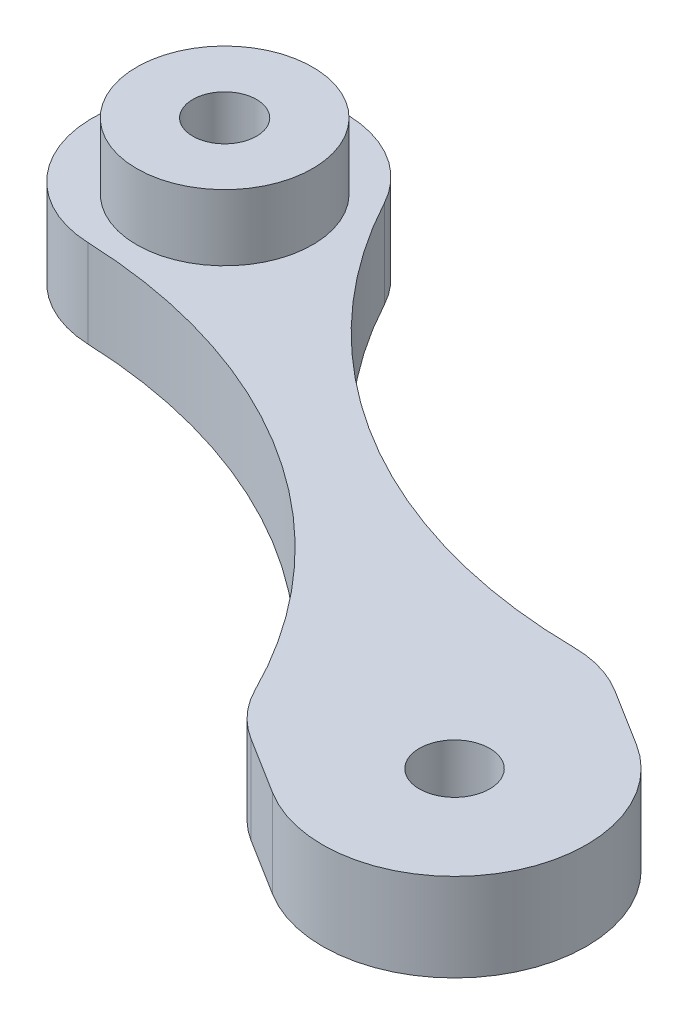
ISO-10303-21;
HEADER;
FILE_DESCRIPTION(('STEP AP214'),'2;1');
FILE_NAME('part.step','',(''),(''),'','','');
FILE_SCHEMA(('AUTOMOTIVE_DESIGN { 1 0 10303 214 1 1 1 1 }'));
ENDSEC;
DATA;
#1=APPLICATION_CONTEXT('core data for automotive mechanical design processes');
#2=APPLICATION_PROTOCOL_DEFINITION('international standard','automotive_design',2000,#1);
#3=PRODUCT_CONTEXT('',#1,'mechanical');
#4=PRODUCT('Part','Part','',(#3));
#5=PRODUCT_RELATED_PRODUCT_CATEGORY('part','',(#4));
#6=PRODUCT_DEFINITION_FORMATION('','',#4);
#7=PRODUCT_DEFINITION_CONTEXT('part definition',#1,'design');
#8=PRODUCT_DEFINITION('design','',#6,#7);
#9=PRODUCT_DEFINITION_SHAPE('','',#8);
#10=(LENGTH_UNIT() NAMED_UNIT(*) SI_UNIT(.MILLI.,.METRE.));
#11=(NAMED_UNIT(*) PLANE_ANGLE_UNIT() SI_UNIT($,.RADIAN.));
#12=(NAMED_UNIT(*) SI_UNIT($,.STERADIAN.) SOLID_ANGLE_UNIT());
#13=UNCERTAINTY_MEASURE_WITH_UNIT(LENGTH_MEASURE(1.E-05),#10,'distance_accuracy_value','');
#14=(GEOMETRIC_REPRESENTATION_CONTEXT(3) GLOBAL_UNCERTAINTY_ASSIGNED_CONTEXT((#13)) GLOBAL_UNIT_ASSIGNED_CONTEXT((#10,
#11,#12)) REPRESENTATION_CONTEXT('',''));
#15=CARTESIAN_POINT('',(0.,0.,0.));
#16=DIRECTION('',(0.,0.,1.));
#17=DIRECTION('',(1.,0.,0.));
#18=AXIS2_PLACEMENT_3D('',#15,#16,#17);
#19=CARTESIAN_POINT('',(0.,4.,0.));
#20=DIRECTION('',(0.,1.,0.));
#21=DIRECTION('',(0.,0.,1.));
#22=AXIS2_PLACEMENT_3D('',#19,#20,#21);
#23=PLANE('',#22);
#24=DIRECTION('',(0.848083831845952,0.,0.529862070884006));
#25=VECTOR('',#24,1.);
#26=CARTESIAN_POINT('',(3.17917242530403,4.,-5.08850299107571));
#27=LINE('',#26,#25);
#28=CARTESIAN_POINT('',(28.4040151900295,4.,10.6713628655212));
#29=VERTEX_POINT('',#28);
#30=CARTESIAN_POINT('',(31.0291724253041,4.,12.3114970089243));
#31=VERTEX_POINT('',#30);
#32=EDGE_CURVE('E156',#29,#31,#27,.T.);
#33=ORIENTED_EDGE('',*,*,#32,.F.);
#34=CARTESIAN_POINT('',(25.7547048356095,4.,14.9117820247509));
#35=DIRECTION('',(0.,1.,0.));
#36=DIRECTION('',(0.,0.,1.));
#37=AXIS2_PLACEMENT_3D('',#34,#35,#36);
#38=CIRCLE('',#37,5.);
#39=CARTESIAN_POINT('',(25.7988021507417,4.,9.91197648585263));
#40=VERTEX_POINT('',#39);
#41=EDGE_CURVE('E182',#29,#40,#38,.T.);
#42=ORIENTED_EDGE('',*,*,#41,.T.);
#43=CARTESIAN_POINT('',(26.0192887264028,4.,-15.0870512086389));
#44=DIRECTION('',(0.,1.,0.));
#45=DIRECTION('',(0.,0.,-1.));
#46=AXIS2_PLACEMENT_3D('',#43,#44,#45);
#47=CIRCLE('',#46,25.);
#48=CARTESIAN_POINT('',(3.98774780070268,4.,-3.2713326761416));
#49=VERTEX_POINT('',#48);
#50=EDGE_CURVE('E212',#49,#40,#47,.T.);
#51=ORIENTED_EDGE('',*,*,#50,.F.);
#52=CARTESIAN_POINT('',(-0.418560384437353,4.,-0.908188969642144));
#53=DIRECTION('',(0.,1.,0.));
#54=DIRECTION('',(0.,0.,1.));
#55=AXIS2_PLACEMENT_3D('',#52,#53,#54);
#56=CIRCLE('',#55,5.);
#57=CARTESIAN_POINT('',(-2.51136230662411,4.,-5.44913381785286));
#58=VERTEX_POINT('',#57);
#59=EDGE_CURVE('E179',#49,#58,#56,.T.);
#60=ORIENTED_EDGE('',*,*,#59,.T.);
#61=CARTESIAN_POINT('',(0.,4.,0.));
#62=DIRECTION('',(0.,1.,0.));
#63=DIRECTION('',(0.,0.,1.));
#64=AXIS2_PLACEMENT_3D('',#61,#62,#63);
#65=CIRCLE('',#64,6.);
#66=CARTESIAN_POINT('',(-5.99854000997113,4.,0.13235463261871));
#67=VERTEX_POINT('',#66);
#68=EDGE_CURVE('E120',#58,#67,#65,.T.);
#69=ORIENTED_EDGE('',*,*,#68,.T.);
#70=CARTESIAN_POINT('',(-0.999756668328522,4.,0.0220591054364517));
#71=DIRECTION('',(0.,1.,0.));
#72=DIRECTION('',(0.,0.,1.));
#73=AXIS2_PLACEMENT_3D('',#70,#71,#72);
#74=CIRCLE('',#73,5.);
#75=CARTESIAN_POINT('',(-1.19146389027376,4.,5.01838258786371));
#76=VERTEX_POINT('',#75);
#77=EDGE_CURVE('E56',#67,#76,#74,.T.);
#78=ORIENTED_EDGE('',*,*,#77,.T.);
#79=CARTESIAN_POINT('',(-2.14999999999998,4.,30.));
#80=DIRECTION('',(0.,1.,0.));
#81=DIRECTION('',(0.,0.,1.));
#82=AXIS2_PLACEMENT_3D('',#79,#80,#81);
#83=CIRCLE('',#82,25.);
#84=CARTESIAN_POINT('',(20.2208172448679,4.,18.8399580737024));
#85=VERTEX_POINT('',#84);
#86=EDGE_CURVE('E210',#85,#76,#83,.T.);
#87=ORIENTED_EDGE('',*,*,#86,.F.);
#88=CARTESIAN_POINT('',(24.6949806938415,4.,16.6079496884428));
#89=DIRECTION('',(0.,1.,0.));
#90=DIRECTION('',(0.,0.,1.));
#91=AXIS2_PLACEMENT_3D('',#88,#89,#90);
#92=CIRCLE('',#91,5.);
#93=CARTESIAN_POINT('',(22.0456703394215,4.,20.8483688476726));
#94=VERTEX_POINT('',#93);
#95=EDGE_CURVE('E50',#85,#94,#92,.T.);
#96=ORIENTED_EDGE('',*,*,#95,.T.);
#97=DIRECTION('',(0.848083831845952,0.,0.529862070884006));
#98=VECTOR('',#97,1.);
#99=CARTESIAN_POINT('',(-3.17917242530403,4.,5.08850299107571));
#100=LINE('',#99,#98);
#101=CARTESIAN_POINT('',(24.670827574696,4.,22.4885029910757));
#102=VERTEX_POINT('',#101);
#103=EDGE_CURVE('E110',#94,#102,#100,.T.);
#104=ORIENTED_EDGE('',*,*,#103,.T.);
#105=CARTESIAN_POINT('',(27.85,4.,17.4));
#106=DIRECTION('',(0.,1.,0.));
#107=DIRECTION('',(0.,0.,1.));
#108=AXIS2_PLACEMENT_3D('',#105,#106,#107);
#109=CIRCLE('',#108,6.);
#110=EDGE_CURVE('E115',#102,#31,#109,.T.);
#111=ORIENTED_EDGE('',*,*,#110,.T.);
#112=EDGE_LOOP('',(#33,#42,#51,#60,#69,#78,#87,#96,#104,#111));
#113=FACE_BOUND('',#112,.T.);
#114=CARTESIAN_POINT('',(27.85,4.,17.4));
#115=DIRECTION('',(0.,1.,0.));
#116=DIRECTION('',(0.,0.,1.));
#117=AXIS2_PLACEMENT_3D('',#114,#115,#116);
#118=CIRCLE('',#117,1.6);
#119=CARTESIAN_POINT('',(27.85,4.,19.));
#120=VERTEX_POINT('',#119);
#121=EDGE_CURVE('E135',#120,#120,#118,.T.);
#122=ORIENTED_EDGE('',*,*,#121,.F.);
#123=EDGE_LOOP('',(#122));
#124=FACE_BOUND('',#123,.T.);
#125=CARTESIAN_POINT('',(0.,4.,0.));
#126=DIRECTION('',(0.,1.,0.));
#127=DIRECTION('',(0.,0.,1.));
#128=AXIS2_PLACEMENT_3D('',#125,#126,#127);
#129=CIRCLE('',#128,4.);
#130=CARTESIAN_POINT('',(0.,4.,4.));
#131=VERTEX_POINT('',#130);
#132=EDGE_CURVE('E202',#131,#131,#129,.T.);
#133=ORIENTED_EDGE('',*,*,#132,.F.);
#134=EDGE_LOOP('',(#133));
#135=FACE_BOUND('',#134,.T.);
#136=ADVANCED_FACE('F35',(#113,#124,#135),#23,.T.);
#137=CARTESIAN_POINT('',(3.17917242530403,4.,-5.08850299107571));
#138=DIRECTION('',(0.529862070884006,0.,-0.848083831845952));
#139=DIRECTION('',(-0.848083831845952,0.,-0.529862070884006));
#140=AXIS2_PLACEMENT_3D('',#137,#138,#139);
#141=PLANE('',#140);
#142=DIRECTION('',(0.848083831845952,0.,0.529862070884006));
#143=VECTOR('',#142,1.);
#144=CARTESIAN_POINT('',(3.17917242530403,0.,-5.08850299107571));
#145=LINE('',#144,#143);
#146=CARTESIAN_POINT('',(28.4040151900295,0.,10.6713628655212));
#147=VERTEX_POINT('',#146);
#148=CARTESIAN_POINT('',(31.0291724253041,0.,12.3114970089243));
#149=VERTEX_POINT('',#148);
#150=EDGE_CURVE('E141',#147,#149,#145,.T.);
#151=ORIENTED_EDGE('',*,*,#150,.F.);
#152=DIRECTION('',(0.,-1.,0.));
#153=VECTOR('',#152,1.);
#154=CARTESIAN_POINT('',(28.4040151900295,4.,10.6713628655212));
#155=LINE('',#154,#153);
#156=EDGE_CURVE('E176',#147,#29,#155,.F.);
#157=ORIENTED_EDGE('',*,*,#156,.T.);
#158=ORIENTED_EDGE('',*,*,#32,.T.);
#159=DIRECTION('',(0.,-1.,0.));
#160=VECTOR('',#159,1.);
#161=CARTESIAN_POINT('',(31.0291724253041,4.,12.3114970089243));
#162=LINE('',#161,#160);
#163=EDGE_CURVE('E131',#31,#149,#162,.T.);
#164=ORIENTED_EDGE('',*,*,#163,.T.);
#165=EDGE_LOOP('',(#151,#157,#158,#164));
#166=FACE_BOUND('',#165,.T.);
#167=ADVANCED_FACE('F228',(#166),#141,.T.);
#168=CARTESIAN_POINT('',(0.,4.,0.));
#169=DIRECTION('',(0.,-1.,0.));
#170=DIRECTION('',(0.,0.,-1.));
#171=AXIS2_PLACEMENT_3D('',#168,#169,#170);
#172=CYLINDRICAL_SURFACE('',#171,6.);
#173=ORIENTED_EDGE('',*,*,#68,.F.);
#174=DIRECTION('',(0.,-1.,0.));
#175=VECTOR('',#174,1.);
#176=CARTESIAN_POINT('',(-2.51136230662411,4.,-5.44913381785286));
#177=LINE('',#176,#175);
#178=CARTESIAN_POINT('',(-2.51136230662411,0.,-5.44913381785286));
#179=VERTEX_POINT('',#178);
#180=EDGE_CURVE('E11',#58,#179,#177,.T.);
#181=ORIENTED_EDGE('',*,*,#180,.T.);
#182=CARTESIAN_POINT('',(0.,0.,0.));
#183=DIRECTION('',(0.,1.,0.));
#184=DIRECTION('',(0.,0.,1.));
#185=AXIS2_PLACEMENT_3D('',#182,#183,#184);
#186=CIRCLE('',#185,6.);
#187=CARTESIAN_POINT('',(-5.99854000997113,0.,0.13235463261871));
#188=VERTEX_POINT('',#187);
#189=EDGE_CURVE('E143',#179,#188,#186,.T.);
#190=ORIENTED_EDGE('',*,*,#189,.T.);
#191=DIRECTION('',(0.,-1.,0.));
#192=VECTOR('',#191,1.);
#193=CARTESIAN_POINT('',(-5.99854000997113,4.,0.13235463261871));
#194=LINE('',#193,#192);
#195=EDGE_CURVE('E43',#188,#67,#194,.F.);
#196=ORIENTED_EDGE('',*,*,#195,.T.);
#197=EDGE_LOOP('',(#173,#181,#190,#196));
#198=FACE_BOUND('',#197,.T.);
#199=ADVANCED_FACE('F193',(#198),#172,.T.);
#200=CARTESIAN_POINT('',(-3.17917242530403,4.,5.08850299107571));
#201=DIRECTION('',(0.529862070884006,0.,-0.848083831845952));
#202=DIRECTION('',(-0.848083831845952,0.,-0.529862070884006));
#203=AXIS2_PLACEMENT_3D('',#200,#201,#202);
#204=PLANE('',#203);
#205=ORIENTED_EDGE('',*,*,#103,.F.);
#206=DIRECTION('',(0.,1.,0.));
#207=VECTOR('',#206,1.);
#208=CARTESIAN_POINT('',(22.0456703394215,4.,20.8483688476726));
#209=LINE('',#208,#207);
#210=CARTESIAN_POINT('',(22.0456703394215,0.,20.8483688476726));
#211=VERTEX_POINT('',#210);
#212=EDGE_CURVE('E184',#94,#211,#209,.F.);
#213=ORIENTED_EDGE('',*,*,#212,.T.);
#214=DIRECTION('',(0.848083831845952,0.,0.529862070884006));
#215=VECTOR('',#214,1.);
#216=CARTESIAN_POINT('',(-3.17917242530403,0.,5.08850299107571));
#217=LINE('',#216,#215);
#218=CARTESIAN_POINT('',(24.670827574696,0.,22.4885029910757));
#219=VERTEX_POINT('',#218);
#220=EDGE_CURVE('E126',#211,#219,#217,.T.);
#221=ORIENTED_EDGE('',*,*,#220,.T.);
#222=DIRECTION('',(0.,-1.,0.));
#223=VECTOR('',#222,1.);
#224=CARTESIAN_POINT('',(24.670827574696,4.,22.4885029910757));
#225=LINE('',#224,#223);
#226=EDGE_CURVE('E123',#102,#219,#225,.T.);
#227=ORIENTED_EDGE('',*,*,#226,.F.);
#228=EDGE_LOOP('',(#205,#213,#221,#227));
#229=FACE_BOUND('',#228,.T.);
#230=ADVANCED_FACE('F124',(#229),#204,.F.);
#231=CARTESIAN_POINT('',(0.,4.,0.));
#232=DIRECTION('',(0.,-1.,0.));
#233=DIRECTION('',(0.,0.,-1.));
#234=AXIS2_PLACEMENT_3D('',#231,#232,#233);
#235=CYLINDRICAL_SURFACE('',#234,1.45);
#236=CARTESIAN_POINT('',(0.,0.,0.));
#237=DIRECTION('',(0.,1.,0.));
#238=DIRECTION('',(0.,0.,1.));
#239=AXIS2_PLACEMENT_3D('',#236,#237,#238);
#240=CIRCLE('',#239,1.45);
#241=CARTESIAN_POINT('',(0.,0.,1.45));
#242=VERTEX_POINT('',#241);
#243=EDGE_CURVE('E150',#242,#242,#240,.T.);
#244=ORIENTED_EDGE('',*,*,#243,.F.);
#245=EDGE_LOOP('',(#244));
#246=FACE_BOUND('',#245,.T.);
#247=CARTESIAN_POINT('',(0.,7.,0.));
#248=DIRECTION('',(0.,1.,0.));
#249=DIRECTION('',(0.,0.,1.));
#250=AXIS2_PLACEMENT_3D('',#247,#248,#249);
#251=CIRCLE('',#250,1.45);
#252=CARTESIAN_POINT('',(0.,7.,1.45));
#253=VERTEX_POINT('',#252);
#254=EDGE_CURVE('E205',#253,#253,#251,.T.);
#255=ORIENTED_EDGE('',*,*,#254,.T.);
#256=EDGE_LOOP('',(#255));
#257=FACE_BOUND('',#256,.T.);
#258=ADVANCED_FACE('F262',(#246,#257),#235,.F.);
#259=CARTESIAN_POINT('',(27.85,4.,17.4));
#260=DIRECTION('',(0.,-1.,0.));
#261=DIRECTION('',(0.,0.,-1.));
#262=AXIS2_PLACEMENT_3D('',#259,#260,#261);
#263=CYLINDRICAL_SURFACE('',#262,6.);
#264=CARTESIAN_POINT('',(27.85,0.,17.4));
#265=DIRECTION('',(0.,1.,0.));
#266=DIRECTION('',(0.,0.,1.));
#267=AXIS2_PLACEMENT_3D('',#264,#265,#266);
#268=CIRCLE('',#267,6.);
#269=EDGE_CURVE('E148',#219,#149,#268,.T.);
#270=ORIENTED_EDGE('',*,*,#269,.T.);
#271=ORIENTED_EDGE('',*,*,#163,.F.);
#272=ORIENTED_EDGE('',*,*,#110,.F.);
#273=ORIENTED_EDGE('',*,*,#226,.T.);
#274=EDGE_LOOP('',(#270,#271,#272,#273));
#275=FACE_BOUND('',#274,.T.);
#276=ADVANCED_FACE('F133',(#275),#263,.T.);
#277=CARTESIAN_POINT('',(27.85,4.,17.4));
#278=DIRECTION('',(0.,-1.,0.));
#279=DIRECTION('',(0.,0.,-1.));
#280=AXIS2_PLACEMENT_3D('',#277,#278,#279);
#281=CYLINDRICAL_SURFACE('',#280,1.6);
#282=ORIENTED_EDGE('',*,*,#121,.T.);
#283=EDGE_LOOP('',(#282));
#284=FACE_BOUND('',#283,.T.);
#285=CARTESIAN_POINT('',(27.85,0.,17.4));
#286=DIRECTION('',(0.,1.,0.));
#287=DIRECTION('',(0.,0.,1.));
#288=AXIS2_PLACEMENT_3D('',#285,#286,#287);
#289=CIRCLE('',#288,1.6);
#290=CARTESIAN_POINT('',(27.85,0.,19.));
#291=VERTEX_POINT('',#290);
#292=EDGE_CURVE('E153',#291,#291,#289,.T.);
#293=ORIENTED_EDGE('',*,*,#292,.F.);
#294=EDGE_LOOP('',(#293));
#295=FACE_BOUND('',#294,.T.);
#296=ADVANCED_FACE('F258',(#284,#295),#281,.F.);
#297=CARTESIAN_POINT('',(0.,0.,0.));
#298=DIRECTION('',(0.,1.,0.));
#299=DIRECTION('',(0.,0.,1.));
#300=AXIS2_PLACEMENT_3D('',#297,#298,#299);
#301=PLANE('',#300);
#302=CARTESIAN_POINT('',(26.0192887264028,0.,-15.0870512086389));
#303=DIRECTION('',(0.,1.,0.));
#304=DIRECTION('',(0.,0.,1.));
#305=AXIS2_PLACEMENT_3D('',#302,#303,#304);
#306=CIRCLE('',#305,25.);
#307=CARTESIAN_POINT('',(3.98774780070268,0.,-3.2713326761416));
#308=VERTEX_POINT('',#307);
#309=CARTESIAN_POINT('',(25.7988021507417,0.,9.91197648585263));
#310=VERTEX_POINT('',#309);
#311=EDGE_CURVE('E160',#308,#310,#306,.T.);
#312=ORIENTED_EDGE('',*,*,#311,.T.);
#313=CARTESIAN_POINT('',(25.7547048356095,0.,14.9117820247509));
#314=DIRECTION('',(0.,1.,0.));
#315=DIRECTION('',(0.,0.,1.));
#316=AXIS2_PLACEMENT_3D('',#313,#314,#315);
#317=CIRCLE('',#316,5.);
#318=EDGE_CURVE('E174',#310,#147,#317,.F.);
#319=ORIENTED_EDGE('',*,*,#318,.T.);
#320=ORIENTED_EDGE('',*,*,#150,.T.);
#321=ORIENTED_EDGE('',*,*,#269,.F.);
#322=ORIENTED_EDGE('',*,*,#220,.F.);
#323=CARTESIAN_POINT('',(24.6949806938415,0.,16.6079496884428));
#324=DIRECTION('',(0.,1.,0.));
#325=DIRECTION('',(0.,0.,1.));
#326=AXIS2_PLACEMENT_3D('',#323,#324,#325);
#327=CIRCLE('',#326,5.);
#328=CARTESIAN_POINT('',(20.2208172448679,0.,18.8399580737024));
#329=VERTEX_POINT('',#328);
#330=EDGE_CURVE('E172',#211,#329,#327,.F.);
#331=ORIENTED_EDGE('',*,*,#330,.T.);
#332=CARTESIAN_POINT('',(-2.14999999999998,0.,30.));
#333=DIRECTION('',(0.,1.,0.));
#334=DIRECTION('',(0.,0.,1.));
#335=AXIS2_PLACEMENT_3D('',#332,#333,#334);
#336=CIRCLE('',#335,25.);
#337=CARTESIAN_POINT('',(-1.19146389027376,0.,5.01838258786371));
#338=VERTEX_POINT('',#337);
#339=EDGE_CURVE('E130',#329,#338,#336,.T.);
#340=ORIENTED_EDGE('',*,*,#339,.T.);
#341=CARTESIAN_POINT('',(-0.999756668328522,0.,0.0220591054364517));
#342=DIRECTION('',(0.,1.,0.));
#343=DIRECTION('',(0.,0.,1.));
#344=AXIS2_PLACEMENT_3D('',#341,#342,#343);
#345=CIRCLE('',#344,5.);
#346=EDGE_CURVE('E168',#338,#188,#345,.F.);
#347=ORIENTED_EDGE('',*,*,#346,.T.);
#348=ORIENTED_EDGE('',*,*,#189,.F.);
#349=CARTESIAN_POINT('',(-0.418560384437353,0.,-0.908188969642144));
#350=DIRECTION('',(0.,1.,0.));
#351=DIRECTION('',(0.,0.,1.));
#352=AXIS2_PLACEMENT_3D('',#349,#350,#351);
#353=CIRCLE('',#352,5.);
#354=EDGE_CURVE('E170',#179,#308,#353,.F.);
#355=ORIENTED_EDGE('',*,*,#354,.T.);
#356=EDGE_LOOP('',(#312,#319,#320,#321,#322,#331,#340,#347,#348,#355));
#357=FACE_BOUND('',#356,.T.);
#358=ORIENTED_EDGE('',*,*,#243,.T.);
#359=EDGE_LOOP('',(#358));
#360=FACE_BOUND('',#359,.T.);
#361=ORIENTED_EDGE('',*,*,#292,.T.);
#362=EDGE_LOOP('',(#361));
#363=FACE_BOUND('',#362,.T.);
#364=ADVANCED_FACE('F225',(#357,#360,#363),#301,.F.);
#365=CARTESIAN_POINT('',(0.,7.,0.));
#366=DIRECTION('',(0.,1.,0.));
#367=DIRECTION('',(0.,0.,1.));
#368=AXIS2_PLACEMENT_3D('',#365,#366,#367);
#369=PLANE('',#368);
#370=CARTESIAN_POINT('',(0.,7.,0.));
#371=DIRECTION('',(0.,1.,0.));
#372=DIRECTION('',(0.,0.,1.));
#373=AXIS2_PLACEMENT_3D('',#370,#371,#372);
#374=CIRCLE('',#373,4.);
#375=CARTESIAN_POINT('',(0.,7.,4.));
#376=VERTEX_POINT('',#375);
#377=EDGE_CURVE('E144',#376,#376,#374,.T.);
#378=ORIENTED_EDGE('',*,*,#377,.T.);
#379=EDGE_LOOP('',(#378));
#380=FACE_BOUND('',#379,.T.);
#381=ORIENTED_EDGE('',*,*,#254,.F.);
#382=EDGE_LOOP('',(#381));
#383=FACE_BOUND('',#382,.T.);
#384=ADVANCED_FACE('F257',(#380,#383),#369,.T.);
#385=CARTESIAN_POINT('',(0.,7.,0.));
#386=DIRECTION('',(0.,-1.,0.));
#387=DIRECTION('',(0.,0.,-1.));
#388=AXIS2_PLACEMENT_3D('',#385,#386,#387);
#389=CYLINDRICAL_SURFACE('',#388,4.);
#390=ORIENTED_EDGE('',*,*,#377,.F.);
#391=EDGE_LOOP('',(#390));
#392=FACE_BOUND('',#391,.T.);
#393=ORIENTED_EDGE('',*,*,#132,.T.);
#394=EDGE_LOOP('',(#393));
#395=FACE_BOUND('',#394,.T.);
#396=ADVANCED_FACE('F253',(#392,#395),#389,.T.);
#397=CARTESIAN_POINT('',(-2.14999999999998,-6.,30.));
#398=DIRECTION('',(0.,1.,0.));
#399=DIRECTION('',(0.,0.,1.));
#400=AXIS2_PLACEMENT_3D('',#397,#398,#399);
#401=CYLINDRICAL_SURFACE('',#400,25.);
#402=ORIENTED_EDGE('',*,*,#339,.F.);
#403=DIRECTION('',(0.,1.,0.));
#404=VECTOR('',#403,1.);
#405=CARTESIAN_POINT('',(20.2208172448679,-6.,18.8399580737024));
#406=LINE('',#405,#404);
#407=EDGE_CURVE('E188',#329,#85,#406,.T.);
#408=ORIENTED_EDGE('',*,*,#407,.T.);
#409=ORIENTED_EDGE('',*,*,#86,.T.);
#410=DIRECTION('',(0.,1.,0.));
#411=VECTOR('',#410,1.);
#412=CARTESIAN_POINT('',(-1.19146389027376,-6.,5.01838258786371));
#413=LINE('',#412,#411);
#414=EDGE_CURVE('E186',#76,#338,#413,.F.);
#415=ORIENTED_EDGE('',*,*,#414,.T.);
#416=EDGE_LOOP('',(#402,#408,#409,#415));
#417=FACE_BOUND('',#416,.T.);
#418=ADVANCED_FACE('F233',(#417),#401,.F.);
#419=CARTESIAN_POINT('',(26.0192887264028,-6.,-15.0870512086389));
#420=DIRECTION('',(0.,1.,0.));
#421=DIRECTION('',(0.,0.,1.));
#422=AXIS2_PLACEMENT_3D('',#419,#420,#421);
#423=CYLINDRICAL_SURFACE('',#422,25.);
#424=ORIENTED_EDGE('',*,*,#50,.T.);
#425=DIRECTION('',(0.,1.,0.));
#426=VECTOR('',#425,1.);
#427=CARTESIAN_POINT('',(25.7988021507417,-6.,9.91197648585263));
#428=LINE('',#427,#426);
#429=EDGE_CURVE('E165',#40,#310,#428,.F.);
#430=ORIENTED_EDGE('',*,*,#429,.T.);
#431=ORIENTED_EDGE('',*,*,#311,.F.);
#432=DIRECTION('',(0.,1.,0.));
#433=VECTOR('',#432,1.);
#434=CARTESIAN_POINT('',(3.98774780070267,-6.,-3.2713326761416));
#435=LINE('',#434,#433);
#436=EDGE_CURVE('E163',#308,#49,#435,.T.);
#437=ORIENTED_EDGE('',*,*,#436,.T.);
#438=EDGE_LOOP('',(#424,#430,#431,#437));
#439=FACE_BOUND('',#438,.T.);
#440=ADVANCED_FACE('F216',(#439),#423,.F.);
#441=CARTESIAN_POINT('',(25.7547048356095,-6.,14.9117820247509));
#442=DIRECTION('',(0.,1.,0.));
#443=DIRECTION('',(0.,0.,1.));
#444=AXIS2_PLACEMENT_3D('',#441,#442,#443);
#445=CYLINDRICAL_SURFACE('',#444,5.);
#446=ORIENTED_EDGE('',*,*,#41,.F.);
#447=ORIENTED_EDGE('',*,*,#156,.F.);
#448=ORIENTED_EDGE('',*,*,#318,.F.);
#449=ORIENTED_EDGE('',*,*,#429,.F.);
#450=EDGE_LOOP('',(#446,#447,#448,#449));
#451=FACE_BOUND('',#450,.T.);
#452=ADVANCED_FACE('F221',(#451),#445,.T.);
#453=CARTESIAN_POINT('',(24.6949806938415,-6.,16.6079496884428));
#454=DIRECTION('',(0.,1.,0.));
#455=DIRECTION('',(0.,0.,1.));
#456=AXIS2_PLACEMENT_3D('',#453,#454,#455);
#457=CYLINDRICAL_SURFACE('',#456,5.);
#458=ORIENTED_EDGE('',*,*,#95,.F.);
#459=ORIENTED_EDGE('',*,*,#407,.F.);
#460=ORIENTED_EDGE('',*,*,#330,.F.);
#461=ORIENTED_EDGE('',*,*,#212,.F.);
#462=EDGE_LOOP('',(#458,#459,#460,#461));
#463=FACE_BOUND('',#462,.T.);
#464=ADVANCED_FACE('F235',(#463),#457,.T.);
#465=CARTESIAN_POINT('',(-0.418560384437353,-6.,-0.908188969642144));
#466=DIRECTION('',(0.,1.,0.));
#467=DIRECTION('',(0.,0.,1.));
#468=AXIS2_PLACEMENT_3D('',#465,#466,#467);
#469=CYLINDRICAL_SURFACE('',#468,5.);
#470=ORIENTED_EDGE('',*,*,#59,.F.);
#471=ORIENTED_EDGE('',*,*,#436,.F.);
#472=ORIENTED_EDGE('',*,*,#354,.F.);
#473=ORIENTED_EDGE('',*,*,#180,.F.);
#474=EDGE_LOOP('',(#470,#471,#472,#473));
#475=FACE_BOUND('',#474,.T.);
#476=ADVANCED_FACE('F237',(#475),#469,.T.);
#477=CARTESIAN_POINT('',(-0.999756668328522,-6.,0.0220591054364517));
#478=DIRECTION('',(0.,-1.,0.));
#479=DIRECTION('',(0.,0.,-1.));
#480=AXIS2_PLACEMENT_3D('',#477,#478,#479);
#481=CYLINDRICAL_SURFACE('',#480,5.);
#482=ORIENTED_EDGE('',*,*,#346,.F.);
#483=ORIENTED_EDGE('',*,*,#414,.F.);
#484=ORIENTED_EDGE('',*,*,#77,.F.);
#485=ORIENTED_EDGE('',*,*,#195,.F.);
#486=EDGE_LOOP('',(#482,#483,#484,#485));
#487=FACE_BOUND('',#486,.T.);
#488=ADVANCED_FACE('F37',(#487),#481,.T.);
#489=CLOSED_SHELL('',(#136,#167,#199,#230,#258,#276,#296,#364,#384,#396,#418,#440,#452,#464,
#476,#488));
#490=MANIFOLD_SOLID_BREP('B2',#489);
#491=ADVANCED_BREP_SHAPE_REPRESENTATION('',(#18,#490),#14);
#492=SHAPE_DEFINITION_REPRESENTATION(#9,#491);
ENDSEC;
END-ISO-10303-21;
